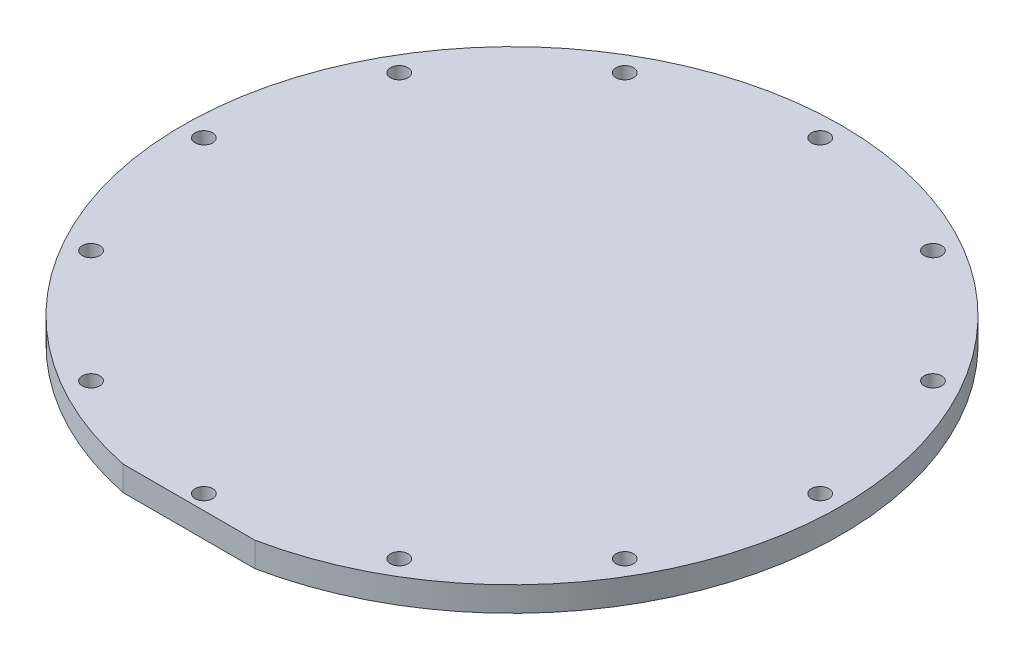
ISO-10303-21;
HEADER;
FILE_DESCRIPTION(('STEP AP214'),'2;1');
FILE_NAME('part.step','',(''),(''),'','','');
FILE_SCHEMA(('AUTOMOTIVE_DESIGN { 1 0 10303 214 1 1 1 1 }'));
ENDSEC;
DATA;
#1=APPLICATION_CONTEXT('core data for automotive mechanical design processes');
#2=APPLICATION_PROTOCOL_DEFINITION('international standard','automotive_design',2000,#1);
#3=PRODUCT_CONTEXT('',#1,'mechanical');
#4=PRODUCT('Part','Part','',(#3));
#5=PRODUCT_RELATED_PRODUCT_CATEGORY('part','',(#4));
#6=PRODUCT_DEFINITION_FORMATION('','',#4);
#7=PRODUCT_DEFINITION_CONTEXT('part definition',#1,'design');
#8=PRODUCT_DEFINITION('design','',#6,#7);
#9=PRODUCT_DEFINITION_SHAPE('','',#8);
#10=(LENGTH_UNIT() NAMED_UNIT(*) SI_UNIT(.MILLI.,.METRE.));
#11=(NAMED_UNIT(*) PLANE_ANGLE_UNIT() SI_UNIT($,.RADIAN.));
#12=(NAMED_UNIT(*) SI_UNIT($,.STERADIAN.) SOLID_ANGLE_UNIT());
#13=UNCERTAINTY_MEASURE_WITH_UNIT(LENGTH_MEASURE(1.E-05),#10,'distance_accuracy_value','');
#14=(GEOMETRIC_REPRESENTATION_CONTEXT(3) GLOBAL_UNCERTAINTY_ASSIGNED_CONTEXT((#13)) GLOBAL_UNIT_ASSIGNED_CONTEXT((#10,
#11,#12)) REPRESENTATION_CONTEXT('',''));
#15=CARTESIAN_POINT('',(0.,0.,0.));
#16=DIRECTION('',(0.,0.,1.));
#17=DIRECTION('',(1.,0.,0.));
#18=AXIS2_PLACEMENT_3D('',#15,#16,#17);
#19=CARTESIAN_POINT('',(0.,0.,0.));
#20=DIRECTION('',(0.,-1.,0.));
#21=DIRECTION('',(0.,0.,-1.));
#22=AXIS2_PLACEMENT_3D('',#19,#20,#21);
#23=PLANE('',#22);
#24=DIRECTION('',(-1.,0.,0.));
#25=VECTOR('',#24,1.);
#26=CARTESIAN_POINT('',(-25.4,0.,124.434078933385));
#27=LINE('',#26,#25);
#28=CARTESIAN_POINT('',(25.4,0.,124.434078933385));
#29=VERTEX_POINT('',#28);
#30=CARTESIAN_POINT('',(-25.4,0.,124.434078933385));
#31=VERTEX_POINT('',#30);
#32=EDGE_CURVE('E69',#29,#31,#27,.T.);
#33=ORIENTED_EDGE('',*,*,#32,.T.);
#34=CARTESIAN_POINT('',(0.,0.,0.));
#35=DIRECTION('',(0.,-1.,0.));
#36=DIRECTION('',(0.,0.,-1.));
#37=AXIS2_PLACEMENT_3D('',#34,#35,#36);
#38=CIRCLE('',#37,127.);
#39=EDGE_CURVE('E11',#31,#29,#38,.T.);
#40=ORIENTED_EDGE('',*,*,#39,.T.);
#41=EDGE_LOOP('',(#33,#40));
#42=FACE_BOUND('',#41,.T.);
#43=CARTESIAN_POINT('',(0.,0.,-118.745));
#44=DIRECTION('',(0.,-1.,0.));
#45=DIRECTION('',(0.,0.,-1.));
#46=AXIS2_PLACEMENT_3D('',#43,#44,#45);
#47=CIRCLE('',#46,3.3782);
#48=CARTESIAN_POINT('',(0.,0.,-122.1232));
#49=VERTEX_POINT('',#48);
#50=EDGE_CURVE('E144',#49,#49,#47,.T.);
#51=ORIENTED_EDGE('',*,*,#50,.F.);
#52=EDGE_LOOP('',(#51));
#53=FACE_BOUND('',#52,.T.);
#54=CARTESIAN_POINT('',(59.3725,0.,-102.836186572383));
#55=DIRECTION('',(0.,-1.,0.));
#56=DIRECTION('',(0.,0.,-1.));
#57=AXIS2_PLACEMENT_3D('',#54,#55,#56);
#58=CIRCLE('',#57,3.3782);
#59=CARTESIAN_POINT('',(59.3725,0.,-106.214386572383));
#60=VERTEX_POINT('',#59);
#61=EDGE_CURVE('E138',#60,#60,#58,.T.);
#62=ORIENTED_EDGE('',*,*,#61,.F.);
#63=EDGE_LOOP('',(#62));
#64=FACE_BOUND('',#63,.T.);
#65=CARTESIAN_POINT('',(102.836186572383,0.,-59.3725));
#66=DIRECTION('',(0.,-1.,0.));
#67=DIRECTION('',(0.,0.,-1.));
#68=AXIS2_PLACEMENT_3D('',#65,#66,#67);
#69=CIRCLE('',#68,3.3782);
#70=CARTESIAN_POINT('',(102.836186572383,0.,-62.7507));
#71=VERTEX_POINT('',#70);
#72=EDGE_CURVE('E132',#71,#71,#69,.T.);
#73=ORIENTED_EDGE('',*,*,#72,.F.);
#74=EDGE_LOOP('',(#73));
#75=FACE_BOUND('',#74,.T.);
#76=CARTESIAN_POINT('',(118.745,0.,0.));
#77=DIRECTION('',(0.,-1.,0.));
#78=DIRECTION('',(0.,0.,-1.));
#79=AXIS2_PLACEMENT_3D('',#76,#77,#78);
#80=CIRCLE('',#79,3.3782);
#81=CARTESIAN_POINT('',(118.745,0.,-3.37820000000001));
#82=VERTEX_POINT('',#81);
#83=EDGE_CURVE('E126',#82,#82,#80,.T.);
#84=ORIENTED_EDGE('',*,*,#83,.F.);
#85=EDGE_LOOP('',(#84));
#86=FACE_BOUND('',#85,.T.);
#87=CARTESIAN_POINT('',(102.836186572383,0.,59.3725));
#88=DIRECTION('',(0.,-1.,0.));
#89=DIRECTION('',(0.,0.,-1.));
#90=AXIS2_PLACEMENT_3D('',#87,#88,#89);
#91=CIRCLE('',#90,3.3782);
#92=CARTESIAN_POINT('',(102.836186572383,0.,55.9943));
#93=VERTEX_POINT('',#92);
#94=EDGE_CURVE('E120',#93,#93,#91,.T.);
#95=ORIENTED_EDGE('',*,*,#94,.F.);
#96=EDGE_LOOP('',(#95));
#97=FACE_BOUND('',#96,.T.);
#98=CARTESIAN_POINT('',(59.3725,0.,102.836186572383));
#99=DIRECTION('',(0.,-1.,0.));
#100=DIRECTION('',(0.,0.,-1.));
#101=AXIS2_PLACEMENT_3D('',#98,#99,#100);
#102=CIRCLE('',#101,3.3782);
#103=CARTESIAN_POINT('',(59.3725,0.,99.4579865723831));
#104=VERTEX_POINT('',#103);
#105=EDGE_CURVE('E114',#104,#104,#102,.T.);
#106=ORIENTED_EDGE('',*,*,#105,.F.);
#107=EDGE_LOOP('',(#106));
#108=FACE_BOUND('',#107,.T.);
#109=CARTESIAN_POINT('',(0.,0.,118.745));
#110=DIRECTION('',(0.,-1.,0.));
#111=DIRECTION('',(0.,0.,-1.));
#112=AXIS2_PLACEMENT_3D('',#109,#110,#111);
#113=CIRCLE('',#112,3.3782);
#114=CARTESIAN_POINT('',(0.,0.,115.3668));
#115=VERTEX_POINT('',#114);
#116=EDGE_CURVE('E108',#115,#115,#113,.T.);
#117=ORIENTED_EDGE('',*,*,#116,.F.);
#118=EDGE_LOOP('',(#117));
#119=FACE_BOUND('',#118,.T.);
#120=CARTESIAN_POINT('',(-59.3725,0.,102.836186572383));
#121=DIRECTION('',(0.,-1.,0.));
#122=DIRECTION('',(0.,0.,-1.));
#123=AXIS2_PLACEMENT_3D('',#120,#121,#122);
#124=CIRCLE('',#123,3.3782);
#125=CARTESIAN_POINT('',(-59.3725,0.,99.4579865723832));
#126=VERTEX_POINT('',#125);
#127=EDGE_CURVE('E102',#126,#126,#124,.T.);
#128=ORIENTED_EDGE('',*,*,#127,.F.);
#129=EDGE_LOOP('',(#128));
#130=FACE_BOUND('',#129,.T.);
#131=CARTESIAN_POINT('',(-102.836186572383,0.,59.3725000000001));
#132=DIRECTION('',(0.,-1.,0.));
#133=DIRECTION('',(0.,0.,-1.));
#134=AXIS2_PLACEMENT_3D('',#131,#132,#133);
#135=CIRCLE('',#134,3.3782);
#136=CARTESIAN_POINT('',(-102.836186572383,0.,55.9943000000001));
#137=VERTEX_POINT('',#136);
#138=EDGE_CURVE('E96',#137,#137,#135,.T.);
#139=ORIENTED_EDGE('',*,*,#138,.F.);
#140=EDGE_LOOP('',(#139));
#141=FACE_BOUND('',#140,.T.);
#142=CARTESIAN_POINT('',(-118.745,0.,0.));
#143=DIRECTION('',(0.,-1.,0.));
#144=DIRECTION('',(0.,0.,-1.));
#145=AXIS2_PLACEMENT_3D('',#142,#143,#144);
#146=CIRCLE('',#145,3.3782);
#147=CARTESIAN_POINT('',(-118.745,0.,-3.37819999999998));
#148=VERTEX_POINT('',#147);
#149=EDGE_CURVE('E90',#148,#148,#146,.T.);
#150=ORIENTED_EDGE('',*,*,#149,.F.);
#151=EDGE_LOOP('',(#150));
#152=FACE_BOUND('',#151,.T.);
#153=CARTESIAN_POINT('',(-102.836186572383,0.,-59.3724999999999));
#154=DIRECTION('',(0.,-1.,0.));
#155=DIRECTION('',(0.,0.,-1.));
#156=AXIS2_PLACEMENT_3D('',#153,#154,#155);
#157=CIRCLE('',#156,3.3782);
#158=CARTESIAN_POINT('',(-102.836186572383,0.,-62.7506999999999));
#159=VERTEX_POINT('',#158);
#160=EDGE_CURVE('E84',#159,#159,#157,.T.);
#161=ORIENTED_EDGE('',*,*,#160,.F.);
#162=EDGE_LOOP('',(#161));
#163=FACE_BOUND('',#162,.T.);
#164=CARTESIAN_POINT('',(-59.3725,0.,-102.836186572383));
#165=DIRECTION('',(0.,-1.,0.));
#166=DIRECTION('',(0.,0.,-1.));
#167=AXIS2_PLACEMENT_3D('',#164,#165,#166);
#168=CIRCLE('',#167,3.3782);
#169=CARTESIAN_POINT('',(-59.3725,0.,-106.214386572383));
#170=VERTEX_POINT('',#169);
#171=EDGE_CURVE('E77',#170,#170,#168,.T.);
#172=ORIENTED_EDGE('',*,*,#171,.F.);
#173=EDGE_LOOP('',(#172));
#174=FACE_BOUND('',#173,.T.);
#175=ADVANCED_FACE('F39',(#42,#53,#64,#75,#86,#97,#108,#119,#130,#141,#152,#163,#174),#23,.T.);
#176=CARTESIAN_POINT('',(0.,0.,0.));
#177=DIRECTION('',(0.,-1.,0.));
#178=DIRECTION('',(0.,0.,-1.));
#179=AXIS2_PLACEMENT_3D('',#176,#177,#178);
#180=CYLINDRICAL_SURFACE('',#179,127.);
#181=DIRECTION('',(0.,-1.,0.));
#182=VECTOR('',#181,1.);
#183=CARTESIAN_POINT('',(25.4,0.,124.434078933385));
#184=LINE('',#183,#182);
#185=CARTESIAN_POINT('',(25.4,9.525,124.434078933385));
#186=VERTEX_POINT('',#185);
#187=EDGE_CURVE('E53',#186,#29,#184,.T.);
#188=ORIENTED_EDGE('',*,*,#187,.T.);
#189=ORIENTED_EDGE('',*,*,#39,.F.);
#190=DIRECTION('',(0.,-1.,0.));
#191=VECTOR('',#190,1.);
#192=CARTESIAN_POINT('',(-25.4,0.,124.434078933385));
#193=LINE('',#192,#191);
#194=CARTESIAN_POINT('',(-25.4,9.525,124.434078933385));
#195=VERTEX_POINT('',#194);
#196=EDGE_CURVE('E58',#31,#195,#193,.F.);
#197=ORIENTED_EDGE('',*,*,#196,.T.);
#198=CARTESIAN_POINT('',(0.,9.525,0.));
#199=DIRECTION('',(0.,-1.,0.));
#200=DIRECTION('',(0.,0.,-1.));
#201=AXIS2_PLACEMENT_3D('',#198,#199,#200);
#202=CIRCLE('',#201,127.);
#203=EDGE_CURVE('E46',#195,#186,#202,.T.);
#204=ORIENTED_EDGE('',*,*,#203,.T.);
#205=EDGE_LOOP('',(#188,#189,#197,#204));
#206=FACE_BOUND('',#205,.T.);
#207=ADVANCED_FACE('F73',(#206),#180,.T.);
#208=CARTESIAN_POINT('',(127.,9.52499999999999,0.));
#209=DIRECTION('',(0.,1.,0.));
#210=DIRECTION('',(0.,0.,1.));
#211=AXIS2_PLACEMENT_3D('',#208,#209,#210);
#212=PLANE('',#211);
#213=DIRECTION('',(-1.,0.,0.));
#214=VECTOR('',#213,1.);
#215=CARTESIAN_POINT('',(-25.4,9.52499999999999,124.434078933385));
#216=LINE('',#215,#214);
#217=EDGE_CURVE('E63',#186,#195,#216,.T.);
#218=ORIENTED_EDGE('',*,*,#217,.F.);
#219=ORIENTED_EDGE('',*,*,#203,.F.);
#220=EDGE_LOOP('',(#218,#219));
#221=FACE_BOUND('',#220,.T.);
#222=CARTESIAN_POINT('',(0.,9.52499999999999,-118.745));
#223=DIRECTION('',(0.,1.,0.));
#224=DIRECTION('',(0.,0.,1.));
#225=AXIS2_PLACEMENT_3D('',#222,#223,#224);
#226=CIRCLE('',#225,3.3782);
#227=CARTESIAN_POINT('',(0.,9.52499999999999,-115.3668));
#228=VERTEX_POINT('',#227);
#229=EDGE_CURVE('E68',#228,#228,#226,.T.);
#230=ORIENTED_EDGE('',*,*,#229,.F.);
#231=EDGE_LOOP('',(#230));
#232=FACE_BOUND('',#231,.T.);
#233=CARTESIAN_POINT('',(59.3725,9.52499999999999,-102.836186572383));
#234=DIRECTION('',(0.,1.,0.));
#235=DIRECTION('',(0.,0.,1.));
#236=AXIS2_PLACEMENT_3D('',#233,#234,#235);
#237=CIRCLE('',#236,3.3782);
#238=CARTESIAN_POINT('',(59.3725,9.52499999999999,-99.4579865723832));
#239=VERTEX_POINT('',#238);
#240=EDGE_CURVE('E141',#239,#239,#237,.T.);
#241=ORIENTED_EDGE('',*,*,#240,.F.);
#242=EDGE_LOOP('',(#241));
#243=FACE_BOUND('',#242,.T.);
#244=CARTESIAN_POINT('',(102.836186572383,9.52499999999999,-59.3725));
#245=DIRECTION('',(0.,1.,0.));
#246=DIRECTION('',(0.,0.,1.));
#247=AXIS2_PLACEMENT_3D('',#244,#245,#246);
#248=CIRCLE('',#247,3.3782);
#249=CARTESIAN_POINT('',(102.836186572383,9.52499999999999,-55.9943));
#250=VERTEX_POINT('',#249);
#251=EDGE_CURVE('E135',#250,#250,#248,.T.);
#252=ORIENTED_EDGE('',*,*,#251,.F.);
#253=EDGE_LOOP('',(#252));
#254=FACE_BOUND('',#253,.T.);
#255=CARTESIAN_POINT('',(118.745,9.52499999999999,0.));
#256=DIRECTION('',(0.,1.,0.));
#257=DIRECTION('',(0.,0.,1.));
#258=AXIS2_PLACEMENT_3D('',#255,#256,#257);
#259=CIRCLE('',#258,3.3782);
#260=CARTESIAN_POINT('',(118.745,9.52499999999999,3.37819999999999));
#261=VERTEX_POINT('',#260);
#262=EDGE_CURVE('E129',#261,#261,#259,.T.);
#263=ORIENTED_EDGE('',*,*,#262,.F.);
#264=EDGE_LOOP('',(#263));
#265=FACE_BOUND('',#264,.T.);
#266=CARTESIAN_POINT('',(102.836186572383,9.52499999999999,59.3725));
#267=DIRECTION('',(0.,1.,0.));
#268=DIRECTION('',(0.,0.,1.));
#269=AXIS2_PLACEMENT_3D('',#266,#267,#268);
#270=CIRCLE('',#269,3.3782);
#271=CARTESIAN_POINT('',(102.836186572383,9.52499999999999,62.7507));
#272=VERTEX_POINT('',#271);
#273=EDGE_CURVE('E123',#272,#272,#270,.T.);
#274=ORIENTED_EDGE('',*,*,#273,.F.);
#275=EDGE_LOOP('',(#274));
#276=FACE_BOUND('',#275,.T.);
#277=CARTESIAN_POINT('',(59.3725,9.52499999999999,102.836186572383));
#278=DIRECTION('',(0.,1.,0.));
#279=DIRECTION('',(0.,0.,1.));
#280=AXIS2_PLACEMENT_3D('',#277,#278,#279);
#281=CIRCLE('',#280,3.3782);
#282=CARTESIAN_POINT('',(59.3725,9.52499999999999,106.214386572383));
#283=VERTEX_POINT('',#282);
#284=EDGE_CURVE('E117',#283,#283,#281,.T.);
#285=ORIENTED_EDGE('',*,*,#284,.F.);
#286=EDGE_LOOP('',(#285));
#287=FACE_BOUND('',#286,.T.);
#288=CARTESIAN_POINT('',(0.,9.52499999999999,118.745));
#289=DIRECTION('',(0.,1.,0.));
#290=DIRECTION('',(0.,0.,1.));
#291=AXIS2_PLACEMENT_3D('',#288,#289,#290);
#292=CIRCLE('',#291,3.3782);
#293=CARTESIAN_POINT('',(0.,9.52499999999999,122.1232));
#294=VERTEX_POINT('',#293);
#295=EDGE_CURVE('E111',#294,#294,#292,.T.);
#296=ORIENTED_EDGE('',*,*,#295,.F.);
#297=EDGE_LOOP('',(#296));
#298=FACE_BOUND('',#297,.T.);
#299=CARTESIAN_POINT('',(-59.3725,9.52499999999999,102.836186572383));
#300=DIRECTION('',(0.,1.,0.));
#301=DIRECTION('',(0.,0.,1.));
#302=AXIS2_PLACEMENT_3D('',#299,#300,#301);
#303=CIRCLE('',#302,3.3782);
#304=CARTESIAN_POINT('',(-59.3725,9.52499999999999,106.214386572383));
#305=VERTEX_POINT('',#304);
#306=EDGE_CURVE('E105',#305,#305,#303,.T.);
#307=ORIENTED_EDGE('',*,*,#306,.F.);
#308=EDGE_LOOP('',(#307));
#309=FACE_BOUND('',#308,.T.);
#310=CARTESIAN_POINT('',(-102.836186572383,9.52499999999999,59.3725000000001));
#311=DIRECTION('',(0.,1.,0.));
#312=DIRECTION('',(0.,0.,1.));
#313=AXIS2_PLACEMENT_3D('',#310,#311,#312);
#314=CIRCLE('',#313,3.3782);
#315=CARTESIAN_POINT('',(-102.836186572383,9.52499999999999,62.7507000000001));
#316=VERTEX_POINT('',#315);
#317=EDGE_CURVE('E99',#316,#316,#314,.T.);
#318=ORIENTED_EDGE('',*,*,#317,.F.);
#319=EDGE_LOOP('',(#318));
#320=FACE_BOUND('',#319,.T.);
#321=CARTESIAN_POINT('',(-118.745,9.52499999999999,0.));
#322=DIRECTION('',(0.,1.,0.));
#323=DIRECTION('',(0.,0.,1.));
#324=AXIS2_PLACEMENT_3D('',#321,#322,#323);
#325=CIRCLE('',#324,3.3782);
#326=CARTESIAN_POINT('',(-118.745,9.52499999999999,3.37820000000002));
#327=VERTEX_POINT('',#326);
#328=EDGE_CURVE('E93',#327,#327,#325,.T.);
#329=ORIENTED_EDGE('',*,*,#328,.F.);
#330=EDGE_LOOP('',(#329));
#331=FACE_BOUND('',#330,.T.);
#332=CARTESIAN_POINT('',(-102.836186572383,9.52499999999999,-59.3724999999999));
#333=DIRECTION('',(0.,1.,0.));
#334=DIRECTION('',(0.,0.,1.));
#335=AXIS2_PLACEMENT_3D('',#332,#333,#334);
#336=CIRCLE('',#335,3.3782);
#337=CARTESIAN_POINT('',(-102.836186572383,9.52499999999999,-55.9942999999999));
#338=VERTEX_POINT('',#337);
#339=EDGE_CURVE('E87',#338,#338,#336,.T.);
#340=ORIENTED_EDGE('',*,*,#339,.F.);
#341=EDGE_LOOP('',(#340));
#342=FACE_BOUND('',#341,.T.);
#343=CARTESIAN_POINT('',(-59.3725,9.52499999999999,-102.836186572383));
#344=DIRECTION('',(0.,1.,0.));
#345=DIRECTION('',(0.,0.,1.));
#346=AXIS2_PLACEMENT_3D('',#343,#344,#345);
#347=CIRCLE('',#346,3.3782);
#348=CARTESIAN_POINT('',(-59.3725,9.52499999999999,-99.4579865723831));
#349=VERTEX_POINT('',#348);
#350=EDGE_CURVE('E79',#349,#349,#347,.T.);
#351=ORIENTED_EDGE('',*,*,#350,.F.);
#352=EDGE_LOOP('',(#351));
#353=FACE_BOUND('',#352,.T.);
#354=ADVANCED_FACE('F75',(#221,#232,#243,#254,#265,#276,#287,#298,#309,#320,#331,#342,#353),
#212,.T.);
#355=CARTESIAN_POINT('',(-59.3725,9.52499999999999,-102.836186572383));
#356=DIRECTION('',(0.,1.,0.));
#357=DIRECTION('',(0.,0.,1.));
#358=AXIS2_PLACEMENT_3D('',#355,#356,#357);
#359=CYLINDRICAL_SURFACE('',#358,3.3782);
#360=ORIENTED_EDGE('',*,*,#350,.T.);
#361=EDGE_LOOP('',(#360));
#362=FACE_BOUND('',#361,.T.);
#363=ORIENTED_EDGE('',*,*,#171,.T.);
#364=EDGE_LOOP('',(#363));
#365=FACE_BOUND('',#364,.T.);
#366=ADVANCED_FACE('F177',(#362,#365),#359,.F.);
#367=CARTESIAN_POINT('',(-102.836186572383,9.52499999999999,-59.3724999999999));
#368=DIRECTION('',(0.,1.,0.));
#369=DIRECTION('',(0.,0.,1.));
#370=AXIS2_PLACEMENT_3D('',#367,#368,#369);
#371=CYLINDRICAL_SURFACE('',#370,3.3782);
#372=ORIENTED_EDGE('',*,*,#339,.T.);
#373=EDGE_LOOP('',(#372));
#374=FACE_BOUND('',#373,.T.);
#375=ORIENTED_EDGE('',*,*,#160,.T.);
#376=EDGE_LOOP('',(#375));
#377=FACE_BOUND('',#376,.T.);
#378=ADVANCED_FACE('F179',(#374,#377),#371,.F.);
#379=CARTESIAN_POINT('',(-118.745,9.52499999999999,0.));
#380=DIRECTION('',(0.,1.,0.));
#381=DIRECTION('',(0.,0.,1.));
#382=AXIS2_PLACEMENT_3D('',#379,#380,#381);
#383=CYLINDRICAL_SURFACE('',#382,3.3782);
#384=ORIENTED_EDGE('',*,*,#328,.T.);
#385=EDGE_LOOP('',(#384));
#386=FACE_BOUND('',#385,.T.);
#387=ORIENTED_EDGE('',*,*,#149,.T.);
#388=EDGE_LOOP('',(#387));
#389=FACE_BOUND('',#388,.T.);
#390=ADVANCED_FACE('F186',(#386,#389),#383,.F.);
#391=CARTESIAN_POINT('',(-102.836186572383,9.52499999999999,59.3725000000001));
#392=DIRECTION('',(0.,1.,0.));
#393=DIRECTION('',(0.,0.,1.));
#394=AXIS2_PLACEMENT_3D('',#391,#392,#393);
#395=CYLINDRICAL_SURFACE('',#394,3.3782);
#396=ORIENTED_EDGE('',*,*,#317,.T.);
#397=EDGE_LOOP('',(#396));
#398=FACE_BOUND('',#397,.T.);
#399=ORIENTED_EDGE('',*,*,#138,.T.);
#400=EDGE_LOOP('',(#399));
#401=FACE_BOUND('',#400,.T.);
#402=ADVANCED_FACE('F275',(#398,#401),#395,.F.);
#403=CARTESIAN_POINT('',(-59.3725,9.52499999999999,102.836186572383));
#404=DIRECTION('',(0.,1.,0.));
#405=DIRECTION('',(0.,0.,1.));
#406=AXIS2_PLACEMENT_3D('',#403,#404,#405);
#407=CYLINDRICAL_SURFACE('',#406,3.3782);
#408=ORIENTED_EDGE('',*,*,#306,.T.);
#409=EDGE_LOOP('',(#408));
#410=FACE_BOUND('',#409,.T.);
#411=ORIENTED_EDGE('',*,*,#127,.T.);
#412=EDGE_LOOP('',(#411));
#413=FACE_BOUND('',#412,.T.);
#414=ADVANCED_FACE('F267',(#410,#413),#407,.F.);
#415=CARTESIAN_POINT('',(0.,9.52499999999999,118.745));
#416=DIRECTION('',(0.,1.,0.));
#417=DIRECTION('',(0.,0.,1.));
#418=AXIS2_PLACEMENT_3D('',#415,#416,#417);
#419=CYLINDRICAL_SURFACE('',#418,3.3782);
#420=ORIENTED_EDGE('',*,*,#295,.T.);
#421=EDGE_LOOP('',(#420));
#422=FACE_BOUND('',#421,.T.);
#423=ORIENTED_EDGE('',*,*,#116,.T.);
#424=EDGE_LOOP('',(#423));
#425=FACE_BOUND('',#424,.T.);
#426=ADVANCED_FACE('F259',(#422,#425),#419,.F.);
#427=CARTESIAN_POINT('',(59.3725,9.52499999999999,102.836186572383));
#428=DIRECTION('',(0.,1.,0.));
#429=DIRECTION('',(0.,0.,1.));
#430=AXIS2_PLACEMENT_3D('',#427,#428,#429);
#431=CYLINDRICAL_SURFACE('',#430,3.3782);
#432=ORIENTED_EDGE('',*,*,#284,.T.);
#433=EDGE_LOOP('',(#432));
#434=FACE_BOUND('',#433,.T.);
#435=ORIENTED_EDGE('',*,*,#105,.T.);
#436=EDGE_LOOP('',(#435));
#437=FACE_BOUND('',#436,.T.);
#438=ADVANCED_FACE('F251',(#434,#437),#431,.F.);
#439=CARTESIAN_POINT('',(102.836186572383,9.52499999999999,59.3725));
#440=DIRECTION('',(0.,1.,0.));
#441=DIRECTION('',(0.,0.,1.));
#442=AXIS2_PLACEMENT_3D('',#439,#440,#441);
#443=CYLINDRICAL_SURFACE('',#442,3.3782);
#444=ORIENTED_EDGE('',*,*,#273,.T.);
#445=EDGE_LOOP('',(#444));
#446=FACE_BOUND('',#445,.T.);
#447=ORIENTED_EDGE('',*,*,#94,.T.);
#448=EDGE_LOOP('',(#447));
#449=FACE_BOUND('',#448,.T.);
#450=ADVANCED_FACE('F243',(#446,#449),#443,.F.);
#451=CARTESIAN_POINT('',(118.745,9.52499999999999,0.));
#452=DIRECTION('',(0.,1.,0.));
#453=DIRECTION('',(0.,0.,1.));
#454=AXIS2_PLACEMENT_3D('',#451,#452,#453);
#455=CYLINDRICAL_SURFACE('',#454,3.3782);
#456=ORIENTED_EDGE('',*,*,#262,.T.);
#457=EDGE_LOOP('',(#456));
#458=FACE_BOUND('',#457,.T.);
#459=ORIENTED_EDGE('',*,*,#83,.T.);
#460=EDGE_LOOP('',(#459));
#461=FACE_BOUND('',#460,.T.);
#462=ADVANCED_FACE('F235',(#458,#461),#455,.F.);
#463=CARTESIAN_POINT('',(102.836186572383,9.52499999999999,-59.3725));
#464=DIRECTION('',(0.,1.,0.));
#465=DIRECTION('',(0.,0.,1.));
#466=AXIS2_PLACEMENT_3D('',#463,#464,#465);
#467=CYLINDRICAL_SURFACE('',#466,3.3782);
#468=ORIENTED_EDGE('',*,*,#251,.T.);
#469=EDGE_LOOP('',(#468));
#470=FACE_BOUND('',#469,.T.);
#471=ORIENTED_EDGE('',*,*,#72,.T.);
#472=EDGE_LOOP('',(#471));
#473=FACE_BOUND('',#472,.T.);
#474=ADVANCED_FACE('F227',(#470,#473),#467,.F.);
#475=CARTESIAN_POINT('',(59.3725,9.52499999999999,-102.836186572383));
#476=DIRECTION('',(0.,1.,0.));
#477=DIRECTION('',(0.,0.,1.));
#478=AXIS2_PLACEMENT_3D('',#475,#476,#477);
#479=CYLINDRICAL_SURFACE('',#478,3.3782);
#480=ORIENTED_EDGE('',*,*,#240,.T.);
#481=EDGE_LOOP('',(#480));
#482=FACE_BOUND('',#481,.T.);
#483=ORIENTED_EDGE('',*,*,#61,.T.);
#484=EDGE_LOOP('',(#483));
#485=FACE_BOUND('',#484,.T.);
#486=ADVANCED_FACE('F219',(#482,#485),#479,.F.);
#487=CARTESIAN_POINT('',(0.,9.52499999999999,-118.745));
#488=DIRECTION('',(0.,1.,0.));
#489=DIRECTION('',(0.,0.,1.));
#490=AXIS2_PLACEMENT_3D('',#487,#488,#489);
#491=CYLINDRICAL_SURFACE('',#490,3.3782);
#492=ORIENTED_EDGE('',*,*,#229,.T.);
#493=EDGE_LOOP('',(#492));
#494=FACE_BOUND('',#493,.T.);
#495=ORIENTED_EDGE('',*,*,#50,.T.);
#496=EDGE_LOOP('',(#495));
#497=FACE_BOUND('',#496,.T.);
#498=ADVANCED_FACE('F209',(#494,#497),#491,.F.);
#499=CARTESIAN_POINT('',(-25.4,-0.000999999999999265,124.434078933385));
#500=DIRECTION('',(0.,0.,-1.));
#501=DIRECTION('',(-1.,0.,0.));
#502=AXIS2_PLACEMENT_3D('',#499,#500,#501);
#503=PLANE('',#502);
#504=ORIENTED_EDGE('',*,*,#187,.F.);
#505=ORIENTED_EDGE('',*,*,#217,.T.);
#506=ORIENTED_EDGE('',*,*,#196,.F.);
#507=ORIENTED_EDGE('',*,*,#32,.F.);
#508=EDGE_LOOP('',(#504,#505,#506,#507));
#509=FACE_BOUND('',#508,.T.);
#510=ADVANCED_FACE('F64',(#509),#503,.F.);
#511=CLOSED_SHELL('',(#175,#207,#354,#366,#378,#390,#402,#414,#426,#438,#450,#462,#474,#486,
#498,#510));
#512=MANIFOLD_SOLID_BREP('B2',#511);
#513=ADVANCED_BREP_SHAPE_REPRESENTATION('',(#18,#512),#14);
#514=SHAPE_DEFINITION_REPRESENTATION(#9,#513);
ENDSEC;
END-ISO-10303-21;
